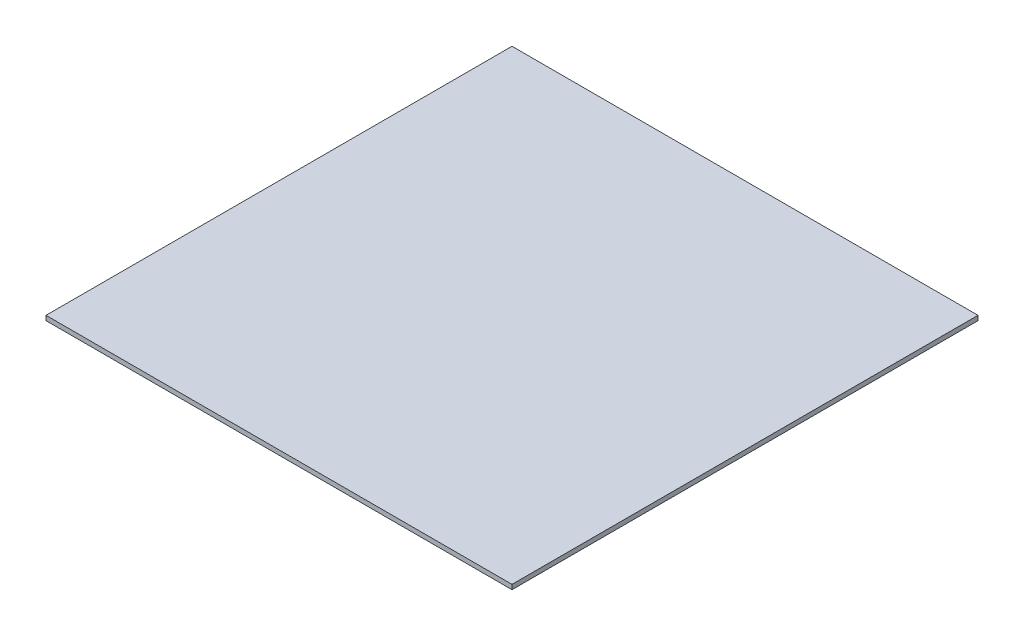
ISO-10303-21;
HEADER;
FILE_DESCRIPTION(('STEP AP214'),'2;1');
FILE_NAME('part.step','',(''),(''),'','','');
FILE_SCHEMA(('AUTOMOTIVE_DESIGN { 1 0 10303 214 1 1 1 1 }'));
ENDSEC;
DATA;
#1=APPLICATION_CONTEXT('core data for automotive mechanical design processes');
#2=APPLICATION_PROTOCOL_DEFINITION('international standard','automotive_design',2000,#1);
#3=PRODUCT_CONTEXT('',#1,'mechanical');
#4=PRODUCT('Part','Part','',(#3));
#5=PRODUCT_RELATED_PRODUCT_CATEGORY('part','',(#4));
#6=PRODUCT_DEFINITION_FORMATION('','',#4);
#7=PRODUCT_DEFINITION_CONTEXT('part definition',#1,'design');
#8=PRODUCT_DEFINITION('design','',#6,#7);
#9=PRODUCT_DEFINITION_SHAPE('','',#8);
#10=(LENGTH_UNIT() NAMED_UNIT(*) SI_UNIT(.MILLI.,.METRE.));
#11=(NAMED_UNIT(*) PLANE_ANGLE_UNIT() SI_UNIT($,.RADIAN.));
#12=(NAMED_UNIT(*) SI_UNIT($,.STERADIAN.) SOLID_ANGLE_UNIT());
#13=UNCERTAINTY_MEASURE_WITH_UNIT(LENGTH_MEASURE(1.E-05),#10,'distance_accuracy_value','');
#14=(GEOMETRIC_REPRESENTATION_CONTEXT(3) GLOBAL_UNCERTAINTY_ASSIGNED_CONTEXT((#13)) GLOBAL_UNIT_ASSIGNED_CONTEXT((#10,
#11,#12)) REPRESENTATION_CONTEXT('',''));
#15=CARTESIAN_POINT('',(0.,0.,0.));
#16=DIRECTION('',(0.,0.,1.));
#17=DIRECTION('',(1.,0.,0.));
#18=AXIS2_PLACEMENT_3D('',#15,#16,#17);
#19=CARTESIAN_POINT('',(0.,6.35,0.));
#20=DIRECTION('',(-1.,0.,0.));
#21=DIRECTION('',(0.,0.,1.));
#22=AXIS2_PLACEMENT_3D('',#19,#20,#21);
#23=PLANE('',#22);
#24=DIRECTION('',(0.,0.,-1.));
#25=VECTOR('',#24,1.);
#26=CARTESIAN_POINT('',(0.,0.,0.));
#27=LINE('',#26,#25);
#28=CARTESIAN_POINT('',(0.,0.,0.));
#29=VERTEX_POINT('',#28);
#30=CARTESIAN_POINT('',(0.,0.,-637.60096));
#31=VERTEX_POINT('',#30);
#32=EDGE_CURVE('E98',#29,#31,#27,.T.);
#33=ORIENTED_EDGE('',*,*,#32,.T.);
#34=DIRECTION('',(0.,-1.,0.));
#35=VECTOR('',#34,1.);
#36=CARTESIAN_POINT('',(0.,6.35,-637.60096));
#37=LINE('',#36,#35);
#38=CARTESIAN_POINT('',(0.,6.35,-637.60096));
#39=VERTEX_POINT('',#38);
#40=EDGE_CURVE('E11',#39,#31,#37,.T.);
#41=ORIENTED_EDGE('',*,*,#40,.F.);
#42=DIRECTION('',(0.,0.,-1.));
#43=VECTOR('',#42,1.);
#44=CARTESIAN_POINT('',(0.,6.35,0.));
#45=LINE('',#44,#43);
#46=CARTESIAN_POINT('',(0.,6.35,0.));
#47=VERTEX_POINT('',#46);
#48=EDGE_CURVE('E86',#47,#39,#45,.T.);
#49=ORIENTED_EDGE('',*,*,#48,.F.);
#50=DIRECTION('',(0.,-1.,0.));
#51=VECTOR('',#50,1.);
#52=CARTESIAN_POINT('',(0.,6.35,0.));
#53=LINE('',#52,#51);
#54=EDGE_CURVE('E94',#47,#29,#53,.T.);
#55=ORIENTED_EDGE('',*,*,#54,.T.);
#56=EDGE_LOOP('',(#33,#41,#49,#55));
#57=FACE_BOUND('',#56,.T.);
#58=ADVANCED_FACE('F35',(#57),#23,.F.);
#59=CARTESIAN_POINT('',(0.,6.35,-637.60096));
#60=DIRECTION('',(0.,0.,1.));
#61=DIRECTION('',(1.,0.,0.));
#62=AXIS2_PLACEMENT_3D('',#59,#60,#61);
#63=PLANE('',#62);
#64=DIRECTION('',(-1.,0.,0.));
#65=VECTOR('',#64,1.);
#66=CARTESIAN_POINT('',(0.,0.,-637.60096));
#67=LINE('',#66,#65);
#68=CARTESIAN_POINT('',(-637.60096,0.,-637.60096));
#69=VERTEX_POINT('',#68);
#70=EDGE_CURVE('E90',#31,#69,#67,.T.);
#71=ORIENTED_EDGE('',*,*,#70,.T.);
#72=DIRECTION('',(0.,-1.,0.));
#73=VECTOR('',#72,1.);
#74=CARTESIAN_POINT('',(-637.60096,6.35,-637.60096));
#75=LINE('',#74,#73);
#76=CARTESIAN_POINT('',(-637.60096,6.35,-637.60096));
#77=VERTEX_POINT('',#76);
#78=EDGE_CURVE('E43',#77,#69,#75,.T.);
#79=ORIENTED_EDGE('',*,*,#78,.F.);
#80=DIRECTION('',(-1.,0.,0.));
#81=VECTOR('',#80,1.);
#82=CARTESIAN_POINT('',(0.,6.35,-637.60096));
#83=LINE('',#82,#81);
#84=EDGE_CURVE('E81',#39,#77,#83,.T.);
#85=ORIENTED_EDGE('',*,*,#84,.F.);
#86=ORIENTED_EDGE('',*,*,#40,.T.);
#87=EDGE_LOOP('',(#71,#79,#85,#86));
#88=FACE_BOUND('',#87,.T.);
#89=ADVANCED_FACE('F89',(#88),#63,.F.);
#90=CARTESIAN_POINT('',(-637.60096,6.35,0.));
#91=DIRECTION('',(1.,0.,0.));
#92=DIRECTION('',(0.,0.,-1.));
#93=AXIS2_PLACEMENT_3D('',#90,#91,#92);
#94=PLANE('',#93);
#95=DIRECTION('',(0.,0.,1.));
#96=VECTOR('',#95,1.);
#97=CARTESIAN_POINT('',(-637.60096,0.,0.));
#98=LINE('',#97,#96);
#99=CARTESIAN_POINT('',(-637.60096,0.,0.));
#100=VERTEX_POINT('',#99);
#101=EDGE_CURVE('E68',#69,#100,#98,.T.);
#102=ORIENTED_EDGE('',*,*,#101,.T.);
#103=DIRECTION('',(0.,-1.,0.));
#104=VECTOR('',#103,1.);
#105=CARTESIAN_POINT('',(-637.60096,6.35,0.));
#106=LINE('',#105,#104);
#107=CARTESIAN_POINT('',(-637.60096,6.35,0.));
#108=VERTEX_POINT('',#107);
#109=EDGE_CURVE('E91',#108,#100,#106,.T.);
#110=ORIENTED_EDGE('',*,*,#109,.F.);
#111=DIRECTION('',(0.,0.,1.));
#112=VECTOR('',#111,1.);
#113=CARTESIAN_POINT('',(-637.60096,6.35,0.));
#114=LINE('',#113,#112);
#115=EDGE_CURVE('E84',#77,#108,#114,.T.);
#116=ORIENTED_EDGE('',*,*,#115,.F.);
#117=ORIENTED_EDGE('',*,*,#78,.T.);
#118=EDGE_LOOP('',(#102,#110,#116,#117));
#119=FACE_BOUND('',#118,.T.);
#120=ADVANCED_FACE('F92',(#119),#94,.F.);
#121=CARTESIAN_POINT('',(0.,6.35,0.));
#122=DIRECTION('',(0.,0.,-1.));
#123=DIRECTION('',(-1.,0.,0.));
#124=AXIS2_PLACEMENT_3D('',#121,#122,#123);
#125=PLANE('',#124);
#126=DIRECTION('',(1.,0.,0.));
#127=VECTOR('',#126,1.);
#128=CARTESIAN_POINT('',(0.,0.,0.));
#129=LINE('',#128,#127);
#130=EDGE_CURVE('E74',#100,#29,#129,.T.);
#131=ORIENTED_EDGE('',*,*,#130,.T.);
#132=ORIENTED_EDGE('',*,*,#54,.F.);
#133=DIRECTION('',(1.,0.,0.));
#134=VECTOR('',#133,1.);
#135=CARTESIAN_POINT('',(0.,6.35,0.));
#136=LINE('',#135,#134);
#137=EDGE_CURVE('E51',#108,#47,#136,.T.);
#138=ORIENTED_EDGE('',*,*,#137,.F.);
#139=ORIENTED_EDGE('',*,*,#109,.T.);
#140=EDGE_LOOP('',(#131,#132,#138,#139));
#141=FACE_BOUND('',#140,.T.);
#142=ADVANCED_FACE('F105',(#141),#125,.F.);
#143=CARTESIAN_POINT('',(0.,6.35,0.));
#144=DIRECTION('',(0.,1.,0.));
#145=DIRECTION('',(0.,0.,1.));
#146=AXIS2_PLACEMENT_3D('',#143,#144,#145);
#147=PLANE('',#146);
#148=ORIENTED_EDGE('',*,*,#48,.T.);
#149=ORIENTED_EDGE('',*,*,#84,.T.);
#150=ORIENTED_EDGE('',*,*,#115,.T.);
#151=ORIENTED_EDGE('',*,*,#137,.T.);
#152=EDGE_LOOP('',(#148,#149,#150,#151));
#153=FACE_BOUND('',#152,.T.);
#154=ADVANCED_FACE('F82',(#153),#147,.T.);
#155=CARTESIAN_POINT('',(0.,0.,0.));
#156=DIRECTION('',(0.,1.,0.));
#157=DIRECTION('',(0.,0.,1.));
#158=AXIS2_PLACEMENT_3D('',#155,#156,#157);
#159=PLANE('',#158);
#160=ORIENTED_EDGE('',*,*,#32,.F.);
#161=ORIENTED_EDGE('',*,*,#130,.F.);
#162=ORIENTED_EDGE('',*,*,#101,.F.);
#163=ORIENTED_EDGE('',*,*,#70,.F.);
#164=EDGE_LOOP('',(#160,#161,#162,#163));
#165=FACE_BOUND('',#164,.T.);
#166=ADVANCED_FACE('F108',(#165),#159,.F.);
#167=CLOSED_SHELL('',(#58,#89,#120,#142,#154,#166));
#168=MANIFOLD_SOLID_BREP('B2',#167);
#169=ADVANCED_BREP_SHAPE_REPRESENTATION('',(#18,#168),#14);
#170=SHAPE_DEFINITION_REPRESENTATION(#9,#169);
ENDSEC;
END-ISO-10303-21;
